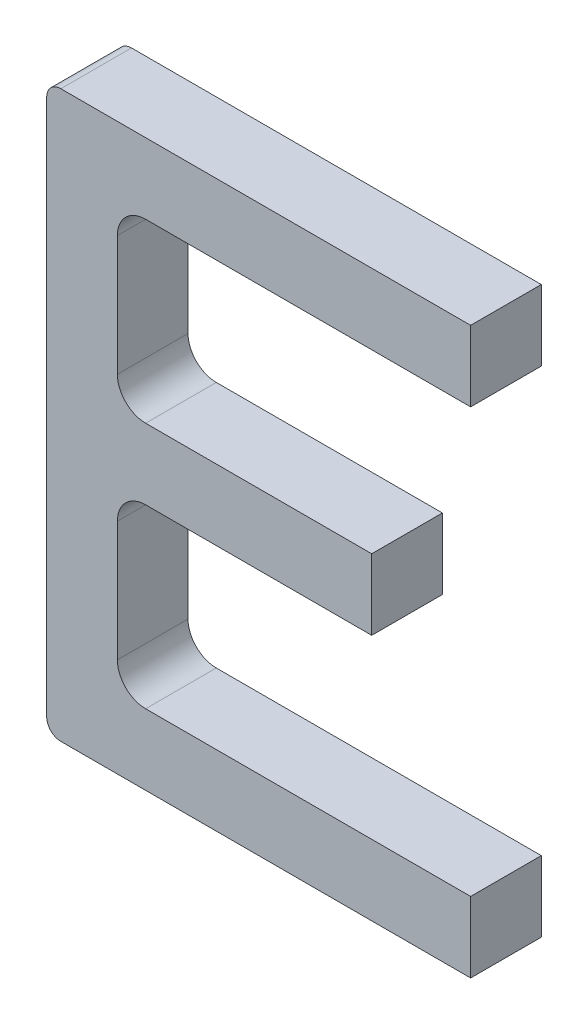
ISO-10303-21;
HEADER;
FILE_DESCRIPTION(('STEP AP214'),'2;1');
FILE_NAME('part.step','',(''),(''),'','','');
FILE_SCHEMA(('AUTOMOTIVE_DESIGN { 1 0 10303 214 1 1 1 1 }'));
ENDSEC;
DATA;
#1=APPLICATION_CONTEXT('core data for automotive mechanical design processes');
#2=APPLICATION_PROTOCOL_DEFINITION('international standard','automotive_design',2000,#1);
#3=PRODUCT_CONTEXT('',#1,'mechanical');
#4=PRODUCT('Part','Part','',(#3));
#5=PRODUCT_RELATED_PRODUCT_CATEGORY('part','',(#4));
#6=PRODUCT_DEFINITION_FORMATION('','',#4);
#7=PRODUCT_DEFINITION_CONTEXT('part definition',#1,'design');
#8=PRODUCT_DEFINITION('design','',#6,#7);
#9=PRODUCT_DEFINITION_SHAPE('','',#8);
#10=(LENGTH_UNIT() NAMED_UNIT(*) SI_UNIT(.MILLI.,.METRE.));
#11=(NAMED_UNIT(*) PLANE_ANGLE_UNIT() SI_UNIT($,.RADIAN.));
#12=(NAMED_UNIT(*) SI_UNIT($,.STERADIAN.) SOLID_ANGLE_UNIT());
#13=UNCERTAINTY_MEASURE_WITH_UNIT(LENGTH_MEASURE(1.E-05),#10,'distance_accuracy_value','');
#14=(GEOMETRIC_REPRESENTATION_CONTEXT(3) GLOBAL_UNCERTAINTY_ASSIGNED_CONTEXT((#13)) GLOBAL_UNIT_ASSIGNED_CONTEXT((#10,
#11,#12)) REPRESENTATION_CONTEXT('',''));
#15=CARTESIAN_POINT('',(0.,0.,0.));
#16=DIRECTION('',(0.,0.,1.));
#17=DIRECTION('',(1.,0.,0.));
#18=AXIS2_PLACEMENT_3D('',#15,#16,#17);
#19=CARTESIAN_POINT('',(38.1,0.,6.35));
#20=DIRECTION('',(1.,0.,0.));
#21=DIRECTION('',(0.,0.,-1.));
#22=AXIS2_PLACEMENT_3D('',#19,#20,#21);
#23=PLANE('',#22);
#24=DIRECTION('',(0.,-1.,0.));
#25=VECTOR('',#24,1.);
#26=CARTESIAN_POINT('',(38.1,0.,0.));
#27=LINE('',#26,#25);
#28=CARTESIAN_POINT('',(38.1,50.8,0.));
#29=VERTEX_POINT('',#28);
#30=CARTESIAN_POINT('',(38.1,44.45,0.));
#31=VERTEX_POINT('',#30);
#32=EDGE_CURVE('E185',#29,#31,#27,.T.);
#33=ORIENTED_EDGE('',*,*,#32,.F.);
#34=DIRECTION('',(0.,0.,-1.));
#35=VECTOR('',#34,1.);
#36=CARTESIAN_POINT('',(38.1,50.8,6.35));
#37=LINE('',#36,#35);
#38=CARTESIAN_POINT('',(38.1,50.8,6.35));
#39=VERTEX_POINT('',#38);
#40=EDGE_CURVE('E174',#39,#29,#37,.T.);
#41=ORIENTED_EDGE('',*,*,#40,.F.);
#42=DIRECTION('',(0.,-1.,0.));
#43=VECTOR('',#42,1.);
#44=CARTESIAN_POINT('',(38.1,0.,6.35));
#45=LINE('',#44,#43);
#46=CARTESIAN_POINT('',(38.1,44.45,6.35));
#47=VERTEX_POINT('',#46);
#48=EDGE_CURVE('E179',#39,#47,#45,.T.);
#49=ORIENTED_EDGE('',*,*,#48,.T.);
#50=DIRECTION('',(0.,0.,-1.));
#51=VECTOR('',#50,1.);
#52=CARTESIAN_POINT('',(38.1,44.45,6.35));
#53=LINE('',#52,#51);
#54=EDGE_CURVE('E230',#47,#31,#53,.T.);
#55=ORIENTED_EDGE('',*,*,#54,.T.);
#56=EDGE_LOOP('',(#33,#41,#49,#55));
#57=FACE_BOUND('',#56,.T.);
#58=ADVANCED_FACE('F47',(#57),#23,.T.);
#59=CARTESIAN_POINT('',(0.,50.8,6.35));
#60=DIRECTION('',(0.,1.,0.));
#61=DIRECTION('',(0.,0.,1.));
#62=AXIS2_PLACEMENT_3D('',#59,#60,#61);
#63=PLANE('',#62);
#64=DIRECTION('',(1.,0.,0.));
#65=VECTOR('',#64,1.);
#66=CARTESIAN_POINT('',(0.,50.8,0.));
#67=LINE('',#66,#65);
#68=CARTESIAN_POINT('',(1.27,50.8,0.));
#69=VERTEX_POINT('',#68);
#70=EDGE_CURVE('E233',#69,#29,#67,.T.);
#71=ORIENTED_EDGE('',*,*,#70,.F.);
#72=DIRECTION('',(0.,0.,-1.));
#73=VECTOR('',#72,1.);
#74=CARTESIAN_POINT('',(1.27,50.8,6.35));
#75=LINE('',#74,#73);
#76=CARTESIAN_POINT('',(1.27,50.8,6.35));
#77=VERTEX_POINT('',#76);
#78=EDGE_CURVE('E11',#69,#77,#75,.F.);
#79=ORIENTED_EDGE('',*,*,#78,.T.);
#80=DIRECTION('',(1.,0.,0.));
#81=VECTOR('',#80,1.);
#82=CARTESIAN_POINT('',(0.,50.8,6.35));
#83=LINE('',#82,#81);
#84=EDGE_CURVE('E171',#77,#39,#83,.T.);
#85=ORIENTED_EDGE('',*,*,#84,.T.);
#86=ORIENTED_EDGE('',*,*,#40,.T.);
#87=EDGE_LOOP('',(#71,#79,#85,#86));
#88=FACE_BOUND('',#87,.T.);
#89=ADVANCED_FACE('F173',(#88),#63,.T.);
#90=CARTESIAN_POINT('',(0.,0.,6.35));
#91=DIRECTION('',(-1.,0.,0.));
#92=DIRECTION('',(0.,0.,1.));
#93=AXIS2_PLACEMENT_3D('',#90,#91,#92);
#94=PLANE('',#93);
#95=DIRECTION('',(0.,1.,0.));
#96=VECTOR('',#95,1.);
#97=CARTESIAN_POINT('',(0.,0.,0.));
#98=LINE('',#97,#96);
#99=CARTESIAN_POINT('',(0.,1.27,0.));
#100=VERTEX_POINT('',#99);
#101=CARTESIAN_POINT('',(0.,49.53,0.));
#102=VERTEX_POINT('',#101);
#103=EDGE_CURVE('E236',#100,#102,#98,.T.);
#104=ORIENTED_EDGE('',*,*,#103,.F.);
#105=DIRECTION('',(0.,0.,-1.));
#106=VECTOR('',#105,1.);
#107=CARTESIAN_POINT('',(0.,1.27,6.35));
#108=LINE('',#107,#106);
#109=CARTESIAN_POINT('',(0.,1.27,6.35));
#110=VERTEX_POINT('',#109);
#111=EDGE_CURVE('E346',#100,#110,#108,.F.);
#112=ORIENTED_EDGE('',*,*,#111,.T.);
#113=DIRECTION('',(0.,1.,0.));
#114=VECTOR('',#113,1.);
#115=CARTESIAN_POINT('',(0.,0.,6.35));
#116=LINE('',#115,#114);
#117=CARTESIAN_POINT('',(0.,49.53,6.35));
#118=VERTEX_POINT('',#117);
#119=EDGE_CURVE('E178',#110,#118,#116,.T.);
#120=ORIENTED_EDGE('',*,*,#119,.T.);
#121=DIRECTION('',(0.,0.,-1.));
#122=VECTOR('',#121,1.);
#123=CARTESIAN_POINT('',(0.,49.53,6.35));
#124=LINE('',#123,#122);
#125=EDGE_CURVE('E342',#118,#102,#124,.T.);
#126=ORIENTED_EDGE('',*,*,#125,.T.);
#127=EDGE_LOOP('',(#104,#112,#120,#126));
#128=FACE_BOUND('',#127,.T.);
#129=ADVANCED_FACE('F367',(#128),#94,.T.);
#130=CARTESIAN_POINT('',(0.,0.,6.35));
#131=DIRECTION('',(0.,1.,0.));
#132=DIRECTION('',(0.,0.,1.));
#133=AXIS2_PLACEMENT_3D('',#130,#131,#132);
#134=PLANE('',#133);
#135=DIRECTION('',(1.,0.,0.));
#136=VECTOR('',#135,1.);
#137=CARTESIAN_POINT('',(0.,0.,6.35));
#138=LINE('',#137,#136);
#139=CARTESIAN_POINT('',(1.27,0.,6.35));
#140=VERTEX_POINT('',#139);
#141=CARTESIAN_POINT('',(38.1,0.,6.35));
#142=VERTEX_POINT('',#141);
#143=EDGE_CURVE('E203',#140,#142,#138,.T.);
#144=ORIENTED_EDGE('',*,*,#143,.F.);
#145=DIRECTION('',(0.,0.,-1.));
#146=VECTOR('',#145,1.);
#147=CARTESIAN_POINT('',(1.27,0.,0.));
#148=LINE('',#147,#146);
#149=CARTESIAN_POINT('',(1.27,0.,0.));
#150=VERTEX_POINT('',#149);
#151=EDGE_CURVE('E332',#140,#150,#148,.T.);
#152=ORIENTED_EDGE('',*,*,#151,.T.);
#153=DIRECTION('',(1.,0.,0.));
#154=VECTOR('',#153,1.);
#155=CARTESIAN_POINT('',(0.,0.,0.));
#156=LINE('',#155,#154);
#157=CARTESIAN_POINT('',(38.1,0.,0.));
#158=VERTEX_POINT('',#157);
#159=EDGE_CURVE('E240',#150,#158,#156,.T.);
#160=ORIENTED_EDGE('',*,*,#159,.T.);
#161=DIRECTION('',(0.,0.,-1.));
#162=VECTOR('',#161,1.);
#163=CARTESIAN_POINT('',(38.1,0.,6.35));
#164=LINE('',#163,#162);
#165=EDGE_CURVE('E188',#142,#158,#164,.T.);
#166=ORIENTED_EDGE('',*,*,#165,.F.);
#167=EDGE_LOOP('',(#144,#152,#160,#166));
#168=FACE_BOUND('',#167,.T.);
#169=ADVANCED_FACE('F358',(#168),#134,.F.);
#170=CARTESIAN_POINT('',(38.1,0.,6.35));
#171=DIRECTION('',(-1.,0.,0.));
#172=DIRECTION('',(0.,-1.,0.));
#173=AXIS2_PLACEMENT_3D('',#170,#171,#172);
#174=PLANE('',#173);
#175=DIRECTION('',(0.,1.,0.));
#176=VECTOR('',#175,1.);
#177=CARTESIAN_POINT('',(38.1,0.,0.));
#178=LINE('',#177,#176);
#179=CARTESIAN_POINT('',(38.1,6.35,0.));
#180=VERTEX_POINT('',#179);
#181=EDGE_CURVE('E243',#158,#180,#178,.T.);
#182=ORIENTED_EDGE('',*,*,#181,.T.);
#183=DIRECTION('',(0.,0.,-1.));
#184=VECTOR('',#183,1.);
#185=CARTESIAN_POINT('',(38.1,6.35,6.35));
#186=LINE('',#185,#184);
#187=CARTESIAN_POINT('',(38.1,6.35,6.35));
#188=VERTEX_POINT('',#187);
#189=EDGE_CURVE('E274',#188,#180,#186,.T.);
#190=ORIENTED_EDGE('',*,*,#189,.F.);
#191=DIRECTION('',(0.,1.,0.));
#192=VECTOR('',#191,1.);
#193=CARTESIAN_POINT('',(38.1,0.,6.35));
#194=LINE('',#193,#192);
#195=EDGE_CURVE('E206',#142,#188,#194,.T.);
#196=ORIENTED_EDGE('',*,*,#195,.F.);
#197=ORIENTED_EDGE('',*,*,#165,.T.);
#198=EDGE_LOOP('',(#182,#190,#196,#197));
#199=FACE_BOUND('',#198,.T.);
#200=ADVANCED_FACE('F425',(#199),#174,.F.);
#201=CARTESIAN_POINT('',(0.,6.35,6.35));
#202=DIRECTION('',(0.,1.,0.));
#203=DIRECTION('',(0.,0.,1.));
#204=AXIS2_PLACEMENT_3D('',#201,#202,#203);
#205=PLANE('',#204);
#206=DIRECTION('',(1.,0.,0.));
#207=VECTOR('',#206,1.);
#208=CARTESIAN_POINT('',(0.,6.35,0.));
#209=LINE('',#208,#207);
#210=CARTESIAN_POINT('',(8.89,6.35,0.));
#211=VERTEX_POINT('',#210);
#212=EDGE_CURVE('E247',#211,#180,#209,.T.);
#213=ORIENTED_EDGE('',*,*,#212,.F.);
#214=DIRECTION('',(0.,0.,-1.));
#215=VECTOR('',#214,1.);
#216=CARTESIAN_POINT('',(8.89,6.35,6.35));
#217=LINE('',#216,#215);
#218=CARTESIAN_POINT('',(8.89,6.35,6.35));
#219=VERTEX_POINT('',#218);
#220=EDGE_CURVE('E301',#211,#219,#217,.F.);
#221=ORIENTED_EDGE('',*,*,#220,.T.);
#222=DIRECTION('',(1.,0.,0.));
#223=VECTOR('',#222,1.);
#224=CARTESIAN_POINT('',(0.,6.35,6.35));
#225=LINE('',#224,#223);
#226=EDGE_CURVE('E210',#219,#188,#225,.T.);
#227=ORIENTED_EDGE('',*,*,#226,.T.);
#228=ORIENTED_EDGE('',*,*,#189,.T.);
#229=EDGE_LOOP('',(#213,#221,#227,#228));
#230=FACE_BOUND('',#229,.T.);
#231=ADVANCED_FACE('F422',(#230),#205,.T.);
#232=CARTESIAN_POINT('',(6.35,0.,6.35));
#233=DIRECTION('',(-1.,0.,0.));
#234=DIRECTION('',(0.,0.,1.));
#235=AXIS2_PLACEMENT_3D('',#232,#233,#234);
#236=PLANE('',#235);
#237=DIRECTION('',(0.,1.,0.));
#238=VECTOR('',#237,1.);
#239=CARTESIAN_POINT('',(6.35,0.,0.));
#240=LINE('',#239,#238);
#241=CARTESIAN_POINT('',(6.35,8.89,0.));
#242=VERTEX_POINT('',#241);
#243=CARTESIAN_POINT('',(6.35,19.685,0.));
#244=VERTEX_POINT('',#243);
#245=EDGE_CURVE('E250',#242,#244,#240,.T.);
#246=ORIENTED_EDGE('',*,*,#245,.T.);
#247=DIRECTION('',(0.,0.,-1.));
#248=VECTOR('',#247,1.);
#249=CARTESIAN_POINT('',(6.35,19.685,6.35));
#250=LINE('',#249,#248);
#251=CARTESIAN_POINT('',(6.35,19.685,6.35));
#252=VERTEX_POINT('',#251);
#253=EDGE_CURVE('E298',#244,#252,#250,.F.);
#254=ORIENTED_EDGE('',*,*,#253,.T.);
#255=DIRECTION('',(0.,1.,0.));
#256=VECTOR('',#255,1.);
#257=CARTESIAN_POINT('',(6.35,0.,6.35));
#258=LINE('',#257,#256);
#259=CARTESIAN_POINT('',(6.35,8.89,6.35));
#260=VERTEX_POINT('',#259);
#261=EDGE_CURVE('E213',#260,#252,#258,.T.);
#262=ORIENTED_EDGE('',*,*,#261,.F.);
#263=DIRECTION('',(0.,0.,-1.));
#264=VECTOR('',#263,1.);
#265=CARTESIAN_POINT('',(6.35,8.89,6.35));
#266=LINE('',#265,#264);
#267=EDGE_CURVE('E294',#260,#242,#266,.T.);
#268=ORIENTED_EDGE('',*,*,#267,.T.);
#269=EDGE_LOOP('',(#246,#254,#262,#268));
#270=FACE_BOUND('',#269,.T.);
#271=ADVANCED_FACE('F413',(#270),#236,.F.);
#272=CARTESIAN_POINT('',(0.,22.225,6.35));
#273=DIRECTION('',(0.,1.,0.));
#274=DIRECTION('',(0.,0.,1.));
#275=AXIS2_PLACEMENT_3D('',#272,#273,#274);
#276=PLANE('',#275);
#277=DIRECTION('',(1.,0.,0.));
#278=VECTOR('',#277,1.);
#279=CARTESIAN_POINT('',(0.,22.225,6.35));
#280=LINE('',#279,#278);
#281=CARTESIAN_POINT('',(8.89,22.225,6.35));
#282=VERTEX_POINT('',#281);
#283=CARTESIAN_POINT('',(29.21,22.225,6.35));
#284=VERTEX_POINT('',#283);
#285=EDGE_CURVE('E217',#282,#284,#280,.T.);
#286=ORIENTED_EDGE('',*,*,#285,.F.);
#287=DIRECTION('',(0.,0.,-1.));
#288=VECTOR('',#287,1.);
#289=CARTESIAN_POINT('',(8.89,22.225,0.));
#290=LINE('',#289,#288);
#291=CARTESIAN_POINT('',(8.89,22.225,0.));
#292=VERTEX_POINT('',#291);
#293=EDGE_CURVE('E290',#282,#292,#290,.T.);
#294=ORIENTED_EDGE('',*,*,#293,.T.);
#295=DIRECTION('',(1.,0.,0.));
#296=VECTOR('',#295,1.);
#297=CARTESIAN_POINT('',(0.,22.225,0.));
#298=LINE('',#297,#296);
#299=CARTESIAN_POINT('',(29.21,22.225,0.));
#300=VERTEX_POINT('',#299);
#301=EDGE_CURVE('E254',#292,#300,#298,.T.);
#302=ORIENTED_EDGE('',*,*,#301,.T.);
#303=DIRECTION('',(0.,0.,-1.));
#304=VECTOR('',#303,1.);
#305=CARTESIAN_POINT('',(29.21,22.225,6.35));
#306=LINE('',#305,#304);
#307=EDGE_CURVE('E270',#284,#300,#306,.T.);
#308=ORIENTED_EDGE('',*,*,#307,.F.);
#309=EDGE_LOOP('',(#286,#294,#302,#308));
#310=FACE_BOUND('',#309,.T.);
#311=ADVANCED_FACE('F405',(#310),#276,.F.);
#312=CARTESIAN_POINT('',(29.21,0.,6.35));
#313=DIRECTION('',(1.,0.,0.));
#314=DIRECTION('',(0.,0.,-1.));
#315=AXIS2_PLACEMENT_3D('',#312,#313,#314);
#316=PLANE('',#315);
#317=DIRECTION('',(0.,-1.,0.));
#318=VECTOR('',#317,1.);
#319=CARTESIAN_POINT('',(29.21,0.,0.));
#320=LINE('',#319,#318);
#321=CARTESIAN_POINT('',(29.21,28.575,0.));
#322=VERTEX_POINT('',#321);
#323=EDGE_CURVE('E257',#322,#300,#320,.T.);
#324=ORIENTED_EDGE('',*,*,#323,.F.);
#325=DIRECTION('',(0.,0.,-1.));
#326=VECTOR('',#325,1.);
#327=CARTESIAN_POINT('',(29.21,28.575,6.35));
#328=LINE('',#327,#326);
#329=CARTESIAN_POINT('',(29.21,28.575,6.35));
#330=VERTEX_POINT('',#329);
#331=EDGE_CURVE('E266',#330,#322,#328,.T.);
#332=ORIENTED_EDGE('',*,*,#331,.F.);
#333=DIRECTION('',(0.,-1.,0.));
#334=VECTOR('',#333,1.);
#335=CARTESIAN_POINT('',(29.21,0.,6.35));
#336=LINE('',#335,#334);
#337=EDGE_CURVE('E221',#330,#284,#336,.T.);
#338=ORIENTED_EDGE('',*,*,#337,.T.);
#339=ORIENTED_EDGE('',*,*,#307,.T.);
#340=EDGE_LOOP('',(#324,#332,#338,#339));
#341=FACE_BOUND('',#340,.T.);
#342=ADVANCED_FACE('F399',(#341),#316,.T.);
#343=CARTESIAN_POINT('',(0.,28.575,6.35));
#344=DIRECTION('',(0.,1.,0.));
#345=DIRECTION('',(-1.,0.,0.));
#346=AXIS2_PLACEMENT_3D('',#343,#344,#345);
#347=PLANE('',#346);
#348=DIRECTION('',(1.,0.,0.));
#349=VECTOR('',#348,1.);
#350=CARTESIAN_POINT('',(0.,28.575,0.));
#351=LINE('',#350,#349);
#352=CARTESIAN_POINT('',(8.89,28.575,0.));
#353=VERTEX_POINT('',#352);
#354=EDGE_CURVE('E261',#353,#322,#351,.T.);
#355=ORIENTED_EDGE('',*,*,#354,.F.);
#356=DIRECTION('',(0.,0.,-1.));
#357=VECTOR('',#356,1.);
#358=CARTESIAN_POINT('',(8.89,28.575,6.35));
#359=LINE('',#358,#357);
#360=CARTESIAN_POINT('',(8.89,28.575,6.35));
#361=VERTEX_POINT('',#360);
#362=EDGE_CURVE('E287',#353,#361,#359,.F.);
#363=ORIENTED_EDGE('',*,*,#362,.T.);
#364=DIRECTION('',(1.,0.,0.));
#365=VECTOR('',#364,1.);
#366=CARTESIAN_POINT('',(0.,28.575,6.35));
#367=LINE('',#366,#365);
#368=EDGE_CURVE('E225',#361,#330,#367,.T.);
#369=ORIENTED_EDGE('',*,*,#368,.T.);
#370=ORIENTED_EDGE('',*,*,#331,.T.);
#371=EDGE_LOOP('',(#355,#363,#369,#370));
#372=FACE_BOUND('',#371,.T.);
#373=ADVANCED_FACE('F395',(#372),#347,.T.);
#374=CARTESIAN_POINT('',(6.35,31.115,6.35));
#375=VERTEX_POINT('',#374);
#376=CARTESIAN_POINT('',(6.35,41.91,6.35));
#377=VERTEX_POINT('',#376);
#378=EDGE_CURVE('E218',#375,#377,#258,.T.);
#379=ORIENTED_EDGE('',*,*,#378,.F.);
#380=DIRECTION('',(0.,0.,-1.));
#381=VECTOR('',#380,1.);
#382=CARTESIAN_POINT('',(6.35,31.115,6.35));
#383=LINE('',#382,#381);
#384=CARTESIAN_POINT('',(6.35,31.115,0.));
#385=VERTEX_POINT('',#384);
#386=EDGE_CURVE('E283',#375,#385,#383,.T.);
#387=ORIENTED_EDGE('',*,*,#386,.T.);
#388=CARTESIAN_POINT('',(6.35,41.91,0.));
#389=VERTEX_POINT('',#388);
#390=EDGE_CURVE('E198',#385,#389,#240,.T.);
#391=ORIENTED_EDGE('',*,*,#390,.T.);
#392=DIRECTION('',(0.,0.,-1.));
#393=VECTOR('',#392,1.);
#394=CARTESIAN_POINT('',(6.35,41.91,6.35));
#395=LINE('',#394,#393);
#396=EDGE_CURVE('E187',#389,#377,#395,.F.);
#397=ORIENTED_EDGE('',*,*,#396,.T.);
#398=EDGE_LOOP('',(#379,#387,#391,#397));
#399=FACE_BOUND('',#398,.T.);
#400=ADVANCED_FACE('F383',(#399),#236,.F.);
#401=CARTESIAN_POINT('',(0.,44.45,6.35));
#402=DIRECTION('',(0.,1.,0.));
#403=DIRECTION('',(0.,0.,1.));
#404=AXIS2_PLACEMENT_3D('',#401,#402,#403);
#405=PLANE('',#404);
#406=DIRECTION('',(1.,0.,0.));
#407=VECTOR('',#406,1.);
#408=CARTESIAN_POINT('',(0.,44.45,6.35));
#409=LINE('',#408,#407);
#410=CARTESIAN_POINT('',(8.89,44.45,6.35));
#411=VERTEX_POINT('',#410);
#412=EDGE_CURVE('E192',#411,#47,#409,.T.);
#413=ORIENTED_EDGE('',*,*,#412,.F.);
#414=DIRECTION('',(0.,0.,-1.));
#415=VECTOR('',#414,1.);
#416=CARTESIAN_POINT('',(8.89,44.45,0.));
#417=LINE('',#416,#415);
#418=CARTESIAN_POINT('',(8.89,44.45,0.));
#419=VERTEX_POINT('',#418);
#420=EDGE_CURVE('E304',#411,#419,#417,.T.);
#421=ORIENTED_EDGE('',*,*,#420,.T.);
#422=DIRECTION('',(1.,0.,0.));
#423=VECTOR('',#422,1.);
#424=CARTESIAN_POINT('',(0.,44.45,0.));
#425=LINE('',#424,#423);
#426=EDGE_CURVE('E195',#419,#31,#425,.T.);
#427=ORIENTED_EDGE('',*,*,#426,.T.);
#428=ORIENTED_EDGE('',*,*,#54,.F.);
#429=EDGE_LOOP('',(#413,#421,#427,#428));
#430=FACE_BOUND('',#429,.T.);
#431=ADVANCED_FACE('F374',(#430),#405,.F.);
#432=CARTESIAN_POINT('',(0.,0.,6.35));
#433=DIRECTION('',(0.,0.,1.));
#434=DIRECTION('',(1.,0.,0.));
#435=AXIS2_PLACEMENT_3D('',#432,#433,#434);
#436=PLANE('',#435);
#437=ORIENTED_EDGE('',*,*,#119,.F.);
#438=CARTESIAN_POINT('',(1.27,1.27,6.35));
#439=DIRECTION('',(0.,0.,1.));
#440=DIRECTION('',(1.,0.,0.));
#441=AXIS2_PLACEMENT_3D('',#438,#439,#440);
#442=CIRCLE('',#441,1.27);
#443=EDGE_CURVE('E56',#110,#140,#442,.T.);
#444=ORIENTED_EDGE('',*,*,#443,.T.);
#445=ORIENTED_EDGE('',*,*,#143,.T.);
#446=ORIENTED_EDGE('',*,*,#195,.T.);
#447=ORIENTED_EDGE('',*,*,#226,.F.);
#448=CARTESIAN_POINT('',(8.89,8.89,6.35));
#449=DIRECTION('',(0.,0.,1.));
#450=DIRECTION('',(1.,0.,0.));
#451=AXIS2_PLACEMENT_3D('',#448,#449,#450);
#452=CIRCLE('',#451,2.54);
#453=EDGE_CURVE('E323',#219,#260,#452,.F.);
#454=ORIENTED_EDGE('',*,*,#453,.T.);
#455=ORIENTED_EDGE('',*,*,#261,.T.);
#456=CARTESIAN_POINT('',(8.89,19.685,6.35));
#457=DIRECTION('',(0.,0.,1.));
#458=DIRECTION('',(1.,0.,0.));
#459=AXIS2_PLACEMENT_3D('',#456,#457,#458);
#460=CIRCLE('',#459,2.54);
#461=EDGE_CURVE('E317',#252,#282,#460,.F.);
#462=ORIENTED_EDGE('',*,*,#461,.T.);
#463=ORIENTED_EDGE('',*,*,#285,.T.);
#464=ORIENTED_EDGE('',*,*,#337,.F.);
#465=ORIENTED_EDGE('',*,*,#368,.F.);
#466=CARTESIAN_POINT('',(8.89,31.115,6.35));
#467=DIRECTION('',(0.,0.,1.));
#468=DIRECTION('',(1.,0.,0.));
#469=AXIS2_PLACEMENT_3D('',#466,#467,#468);
#470=CIRCLE('',#469,2.54);
#471=EDGE_CURVE('E311',#361,#375,#470,.F.);
#472=ORIENTED_EDGE('',*,*,#471,.T.);
#473=ORIENTED_EDGE('',*,*,#378,.T.);
#474=CARTESIAN_POINT('',(8.89,41.91,6.35));
#475=DIRECTION('',(0.,0.,1.));
#476=DIRECTION('',(1.,0.,0.));
#477=AXIS2_PLACEMENT_3D('',#474,#475,#476);
#478=CIRCLE('',#477,2.54);
#479=EDGE_CURVE('E329',#377,#411,#478,.F.);
#480=ORIENTED_EDGE('',*,*,#479,.T.);
#481=ORIENTED_EDGE('',*,*,#412,.T.);
#482=ORIENTED_EDGE('',*,*,#48,.F.);
#483=ORIENTED_EDGE('',*,*,#84,.F.);
#484=CARTESIAN_POINT('',(1.27,49.53,6.35));
#485=DIRECTION('',(0.,0.,1.));
#486=DIRECTION('',(1.,0.,0.));
#487=AXIS2_PLACEMENT_3D('',#484,#485,#486);
#488=CIRCLE('',#487,1.27);
#489=EDGE_CURVE('E68',#77,#118,#488,.T.);
#490=ORIENTED_EDGE('',*,*,#489,.T.);
#491=EDGE_LOOP('',(#437,#444,#445,#446,#447,#454,#455,#462,#463,#464,#465,#472,#473,#480,#481,
#482,#483,#490));
#492=FACE_BOUND('',#491,.T.);
#493=ADVANCED_FACE('F190',(#492),#436,.T.);
#494=CARTESIAN_POINT('',(0.,0.,0.));
#495=DIRECTION('',(0.,0.,1.));
#496=DIRECTION('',(1.,0.,0.));
#497=AXIS2_PLACEMENT_3D('',#494,#495,#496);
#498=PLANE('',#497);
#499=ORIENTED_EDGE('',*,*,#159,.F.);
#500=CARTESIAN_POINT('',(1.27,1.27,0.));
#501=DIRECTION('',(0.,0.,1.));
#502=DIRECTION('',(1.,0.,0.));
#503=AXIS2_PLACEMENT_3D('',#500,#501,#502);
#504=CIRCLE('',#503,1.27);
#505=EDGE_CURVE('E339',#150,#100,#504,.F.);
#506=ORIENTED_EDGE('',*,*,#505,.T.);
#507=ORIENTED_EDGE('',*,*,#103,.T.);
#508=CARTESIAN_POINT('',(1.27,49.53,0.));
#509=DIRECTION('',(0.,0.,1.));
#510=DIRECTION('',(1.,0.,0.));
#511=AXIS2_PLACEMENT_3D('',#508,#509,#510);
#512=CIRCLE('',#511,1.27);
#513=EDGE_CURVE('E336',#102,#69,#512,.F.);
#514=ORIENTED_EDGE('',*,*,#513,.T.);
#515=ORIENTED_EDGE('',*,*,#70,.T.);
#516=ORIENTED_EDGE('',*,*,#32,.T.);
#517=ORIENTED_EDGE('',*,*,#426,.F.);
#518=CARTESIAN_POINT('',(8.89,41.91,0.));
#519=DIRECTION('',(0.,0.,1.));
#520=DIRECTION('',(1.,0.,0.));
#521=AXIS2_PLACEMENT_3D('',#518,#519,#520);
#522=CIRCLE('',#521,2.54);
#523=EDGE_CURVE('E326',#419,#389,#522,.T.);
#524=ORIENTED_EDGE('',*,*,#523,.T.);
#525=ORIENTED_EDGE('',*,*,#390,.F.);
#526=CARTESIAN_POINT('',(8.89,31.115,0.));
#527=DIRECTION('',(0.,0.,1.));
#528=DIRECTION('',(1.,0.,0.));
#529=AXIS2_PLACEMENT_3D('',#526,#527,#528);
#530=CIRCLE('',#529,2.54);
#531=EDGE_CURVE('E308',#385,#353,#530,.T.);
#532=ORIENTED_EDGE('',*,*,#531,.T.);
#533=ORIENTED_EDGE('',*,*,#354,.T.);
#534=ORIENTED_EDGE('',*,*,#323,.T.);
#535=ORIENTED_EDGE('',*,*,#301,.F.);
#536=CARTESIAN_POINT('',(8.89,19.685,0.));
#537=DIRECTION('',(0.,0.,1.));
#538=DIRECTION('',(1.,0.,0.));
#539=AXIS2_PLACEMENT_3D('',#536,#537,#538);
#540=CIRCLE('',#539,2.54);
#541=EDGE_CURVE('E314',#292,#244,#540,.T.);
#542=ORIENTED_EDGE('',*,*,#541,.T.);
#543=ORIENTED_EDGE('',*,*,#245,.F.);
#544=CARTESIAN_POINT('',(8.89,8.89,0.));
#545=DIRECTION('',(0.,0.,1.));
#546=DIRECTION('',(1.,0.,0.));
#547=AXIS2_PLACEMENT_3D('',#544,#545,#546);
#548=CIRCLE('',#547,2.54);
#549=EDGE_CURVE('E320',#242,#211,#548,.T.);
#550=ORIENTED_EDGE('',*,*,#549,.T.);
#551=ORIENTED_EDGE('',*,*,#212,.T.);
#552=ORIENTED_EDGE('',*,*,#181,.F.);
#553=EDGE_LOOP('',(#499,#506,#507,#514,#515,#516,#517,#524,#525,#532,#533,#534,#535,#542,#543,
#550,#551,#552));
#554=FACE_BOUND('',#553,.T.);
#555=ADVANCED_FACE('F364',(#554),#498,.F.);
#556=CARTESIAN_POINT('',(8.89,31.115,6.35));
#557=DIRECTION('',(0.,0.,-1.));
#558=DIRECTION('',(-1.,0.,0.));
#559=AXIS2_PLACEMENT_3D('',#556,#557,#558);
#560=CYLINDRICAL_SURFACE('',#559,2.54);
#561=ORIENTED_EDGE('',*,*,#471,.F.);
#562=ORIENTED_EDGE('',*,*,#362,.F.);
#563=ORIENTED_EDGE('',*,*,#531,.F.);
#564=ORIENTED_EDGE('',*,*,#386,.F.);
#565=EDGE_LOOP('',(#561,#562,#563,#564));
#566=FACE_BOUND('',#565,.T.);
#567=ADVANCED_FACE('F391',(#566),#560,.F.);
#568=CARTESIAN_POINT('',(8.89,19.685,6.35));
#569=DIRECTION('',(0.,0.,1.));
#570=DIRECTION('',(1.,0.,0.));
#571=AXIS2_PLACEMENT_3D('',#568,#569,#570);
#572=CYLINDRICAL_SURFACE('',#571,2.54);
#573=ORIENTED_EDGE('',*,*,#461,.F.);
#574=ORIENTED_EDGE('',*,*,#253,.F.);
#575=ORIENTED_EDGE('',*,*,#541,.F.);
#576=ORIENTED_EDGE('',*,*,#293,.F.);
#577=EDGE_LOOP('',(#573,#574,#575,#576));
#578=FACE_BOUND('',#577,.T.);
#579=ADVANCED_FACE('F409',(#578),#572,.F.);
#580=CARTESIAN_POINT('',(8.89,8.89,6.35));
#581=DIRECTION('',(0.,0.,-1.));
#582=DIRECTION('',(-1.,0.,0.));
#583=AXIS2_PLACEMENT_3D('',#580,#581,#582);
#584=CYLINDRICAL_SURFACE('',#583,2.54);
#585=ORIENTED_EDGE('',*,*,#453,.F.);
#586=ORIENTED_EDGE('',*,*,#220,.F.);
#587=ORIENTED_EDGE('',*,*,#549,.F.);
#588=ORIENTED_EDGE('',*,*,#267,.F.);
#589=EDGE_LOOP('',(#585,#586,#587,#588));
#590=FACE_BOUND('',#589,.T.);
#591=ADVANCED_FACE('F419',(#590),#584,.F.);
#592=CARTESIAN_POINT('',(8.89,41.91,6.35));
#593=DIRECTION('',(0.,0.,1.));
#594=DIRECTION('',(1.,0.,0.));
#595=AXIS2_PLACEMENT_3D('',#592,#593,#594);
#596=CYLINDRICAL_SURFACE('',#595,2.54);
#597=ORIENTED_EDGE('',*,*,#479,.F.);
#598=ORIENTED_EDGE('',*,*,#396,.F.);
#599=ORIENTED_EDGE('',*,*,#523,.F.);
#600=ORIENTED_EDGE('',*,*,#420,.F.);
#601=EDGE_LOOP('',(#597,#598,#599,#600));
#602=FACE_BOUND('',#601,.T.);
#603=ADVANCED_FACE('F378',(#602),#596,.F.);
#604=CARTESIAN_POINT('',(1.27,1.27,6.35));
#605=DIRECTION('',(0.,0.,1.));
#606=DIRECTION('',(1.,0.,0.));
#607=AXIS2_PLACEMENT_3D('',#604,#605,#606);
#608=CYLINDRICAL_SURFACE('',#607,1.27);
#609=ORIENTED_EDGE('',*,*,#443,.F.);
#610=ORIENTED_EDGE('',*,*,#111,.F.);
#611=ORIENTED_EDGE('',*,*,#505,.F.);
#612=ORIENTED_EDGE('',*,*,#151,.F.);
#613=EDGE_LOOP('',(#609,#610,#611,#612));
#614=FACE_BOUND('',#613,.T.);
#615=ADVANCED_FACE('F361',(#614),#608,.T.);
#616=CARTESIAN_POINT('',(1.27,49.53,6.35));
#617=DIRECTION('',(0.,0.,-1.));
#618=DIRECTION('',(-1.,0.,0.));
#619=AXIS2_PLACEMENT_3D('',#616,#617,#618);
#620=CYLINDRICAL_SURFACE('',#619,1.27);
#621=ORIENTED_EDGE('',*,*,#489,.F.);
#622=ORIENTED_EDGE('',*,*,#78,.F.);
#623=ORIENTED_EDGE('',*,*,#513,.F.);
#624=ORIENTED_EDGE('',*,*,#125,.F.);
#625=EDGE_LOOP('',(#621,#622,#623,#624));
#626=FACE_BOUND('',#625,.T.);
#627=ADVANCED_FACE('F49',(#626),#620,.T.);
#628=CLOSED_SHELL('',(#58,#89,#129,#169,#200,#231,#271,#311,#342,#373,#400,#431,#493,#555,#567,
#579,#591,#603,#615,#627));
#629=MANIFOLD_SOLID_BREP('B2',#628);
#630=ADVANCED_BREP_SHAPE_REPRESENTATION('',(#18,#629),#14);
#631=SHAPE_DEFINITION_REPRESENTATION(#9,#630);
ENDSEC;
END-ISO-10303-21;
